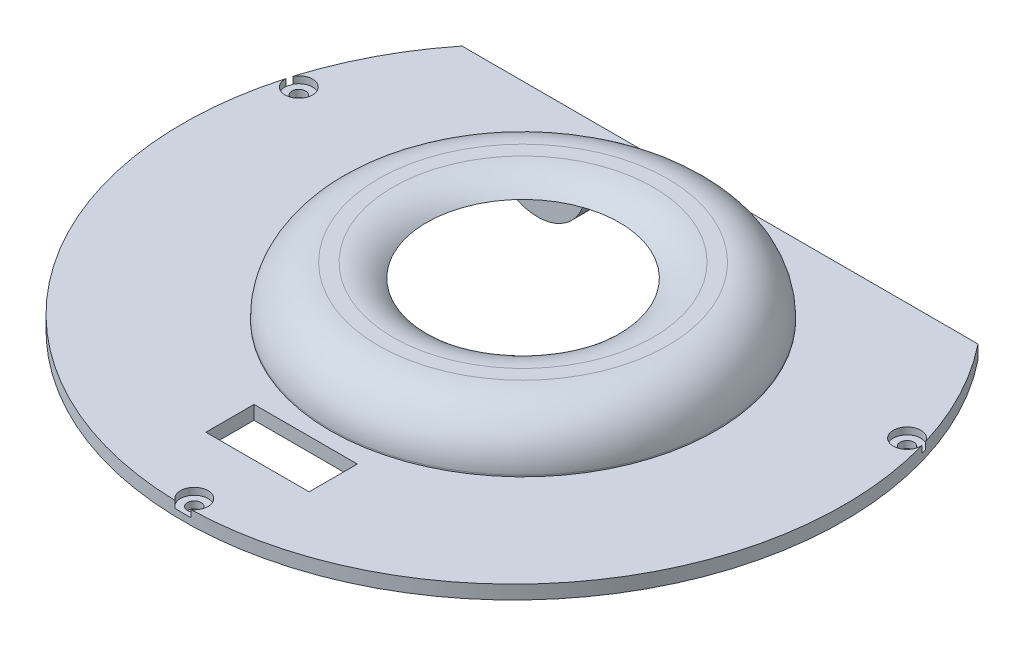
ISO-10303-21;
HEADER;
FILE_DESCRIPTION(('STEP AP214'),'2;1');
FILE_NAME('part.step','',(''),(''),'','','');
FILE_SCHEMA(('AUTOMOTIVE_DESIGN { 1 0 10303 214 1 1 1 1 }'));
ENDSEC;
DATA;
#1=APPLICATION_CONTEXT('core data for automotive mechanical design processes');
#2=APPLICATION_PROTOCOL_DEFINITION('international standard','automotive_design',2000,#1);
#3=PRODUCT_CONTEXT('',#1,'mechanical');
#4=PRODUCT('Part','Part','',(#3));
#5=PRODUCT_RELATED_PRODUCT_CATEGORY('part','',(#4));
#6=PRODUCT_DEFINITION_FORMATION('','',#4);
#7=PRODUCT_DEFINITION_CONTEXT('part definition',#1,'design');
#8=PRODUCT_DEFINITION('design','',#6,#7);
#9=PRODUCT_DEFINITION_SHAPE('','',#8);
#10=(LENGTH_UNIT() NAMED_UNIT(*) SI_UNIT(.MILLI.,.METRE.));
#11=(NAMED_UNIT(*) PLANE_ANGLE_UNIT() SI_UNIT($,.RADIAN.));
#12=(NAMED_UNIT(*) SI_UNIT($,.STERADIAN.) SOLID_ANGLE_UNIT());
#13=UNCERTAINTY_MEASURE_WITH_UNIT(LENGTH_MEASURE(1.E-05),#10,'distance_accuracy_value','');
#14=(GEOMETRIC_REPRESENTATION_CONTEXT(3) GLOBAL_UNCERTAINTY_ASSIGNED_CONTEXT((#13)) GLOBAL_UNIT_ASSIGNED_CONTEXT((#10,
#11,#12)) REPRESENTATION_CONTEXT('',''));
#15=CARTESIAN_POINT('',(0.,0.,0.));
#16=DIRECTION('',(0.,0.,1.));
#17=DIRECTION('',(1.,0.,0.));
#18=AXIS2_PLACEMENT_3D('',#15,#16,#17);
#19=CARTESIAN_POINT('',(0.,2.,0.));
#20=DIRECTION('',(0.,1.,0.));
#21=DIRECTION('',(0.,0.,1.));
#22=AXIS2_PLACEMENT_3D('',#19,#20,#21);
#23=PLANE('',#22);
#24=DIRECTION('',(0.,0.,1.));
#25=VECTOR('',#24,1.);
#26=CARTESIAN_POINT('',(-7.5,2.,30.1663519833163));
#27=LINE('',#26,#25);
#28=CARTESIAN_POINT('',(-7.5,2.,30.1663519833163));
#29=VERTEX_POINT('',#28);
#30=CARTESIAN_POINT('',(-7.5,2.,37.1663519833163));
#31=VERTEX_POINT('',#30);
#32=EDGE_CURVE('E51',#29,#31,#27,.T.);
#33=ORIENTED_EDGE('',*,*,#32,.F.);
#34=DIRECTION('',(-1.,0.,0.));
#35=VECTOR('',#34,1.);
#36=CARTESIAN_POINT('',(-7.5,2.,30.1663519833163));
#37=LINE('',#36,#35);
#38=CARTESIAN_POINT('',(7.5,2.,30.1663519833163));
#39=VERTEX_POINT('',#38);
#40=EDGE_CURVE('E203',#39,#29,#37,.T.);
#41=ORIENTED_EDGE('',*,*,#40,.F.);
#42=DIRECTION('',(0.,0.,-1.));
#43=VECTOR('',#42,1.);
#44=CARTESIAN_POINT('',(7.5,2.,30.1663519833163));
#45=LINE('',#44,#43);
#46=CARTESIAN_POINT('',(7.5,2.,37.1663519833163));
#47=VERTEX_POINT('',#46);
#48=EDGE_CURVE('E188',#47,#39,#45,.T.);
#49=ORIENTED_EDGE('',*,*,#48,.F.);
#50=DIRECTION('',(1.,0.,0.));
#51=VECTOR('',#50,1.);
#52=CARTESIAN_POINT('',(-7.5,2.,37.1663519833163));
#53=LINE('',#52,#51);
#54=EDGE_CURVE('E197',#31,#47,#53,.T.);
#55=ORIENTED_EDGE('',*,*,#54,.F.);
#56=EDGE_LOOP('',(#33,#41,#49,#55));
#57=FACE_BOUND('',#56,.T.);
#58=DIRECTION('',(-1.,0.,0.));
#59=VECTOR('',#58,1.);
#60=CARTESIAN_POINT('',(-37.4699879903904,2.,-30.));
#61=LINE('',#60,#59);
#62=CARTESIAN_POINT('',(37.4699879903904,2.,-30.));
#63=VERTEX_POINT('',#62);
#64=CARTESIAN_POINT('',(-37.4699879903904,2.,-30.));
#65=VERTEX_POINT('',#64);
#66=EDGE_CURVE('E307',#63,#65,#61,.T.);
#67=ORIENTED_EDGE('',*,*,#66,.T.);
#68=CARTESIAN_POINT('',(0.,2.,0.));
#69=DIRECTION('',(0.,1.,0.));
#70=DIRECTION('',(0.,0.,1.));
#71=AXIS2_PLACEMENT_3D('',#68,#69,#70);
#72=CIRCLE('',#71,48.);
#73=CARTESIAN_POINT('',(-45.9296824734979,2.,-13.9450445637027));
#74=VERTEX_POINT('',#73);
#75=EDGE_CURVE('E304',#65,#74,#72,.T.);
#76=ORIENTED_EDGE('',*,*,#75,.T.);
#77=CARTESIAN_POINT('',(-44.1670450256329,2.,-13.));
#78=DIRECTION('',(0.,1.,0.));
#79=DIRECTION('',(0.,0.,1.));
#80=AXIS2_PLACEMENT_3D('',#77,#78,#79);
#81=CIRCLE('',#80,2.);
#82=CARTESIAN_POINT('',(-46.1605913656759,2.,-13.1605396838842));
#83=VERTEX_POINT('',#82);
#84=EDGE_CURVE('E257',#83,#74,#81,.T.);
#85=ORIENTED_EDGE('',*,*,#84,.F.);
#86=CARTESIAN_POINT('',(-1.1468792364282,2.,47.9862966691226));
#87=VERTEX_POINT('',#86);
#88=EDGE_CURVE('E308',#83,#87,#72,.T.);
#89=ORIENTED_EDGE('',*,*,#88,.T.);
#90=CARTESIAN_POINT('',(0.,2.,46.3478010124149));
#91=DIRECTION('',(0.,1.,0.));
#92=DIRECTION('',(0.,0.,1.));
#93=AXIS2_PLACEMENT_3D('',#90,#91,#92);
#94=CIRCLE('',#93,2.);
#95=CARTESIAN_POINT('',(1.14687923642825,2.,47.9862966691226));
#96=VERTEX_POINT('',#95);
#97=EDGE_CURVE('E262',#96,#87,#94,.T.);
#98=ORIENTED_EDGE('',*,*,#97,.F.);
#99=CARTESIAN_POINT('',(46.1605913656758,2.,-13.1605396838842));
#100=VERTEX_POINT('',#99);
#101=EDGE_CURVE('E536',#96,#100,#72,.T.);
#102=ORIENTED_EDGE('',*,*,#101,.T.);
#103=CARTESIAN_POINT('',(44.1670450256329,2.,-13.));
#104=DIRECTION('',(0.,1.,0.));
#105=DIRECTION('',(0.,0.,1.));
#106=AXIS2_PLACEMENT_3D('',#103,#104,#105);
#107=CIRCLE('',#106,2.);
#108=CARTESIAN_POINT('',(45.929682473498,2.,-13.9450445637028));
#109=VERTEX_POINT('',#108);
#110=EDGE_CURVE('E252',#109,#100,#107,.T.);
#111=ORIENTED_EDGE('',*,*,#110,.F.);
#112=EDGE_CURVE('E309',#109,#63,#72,.T.);
#113=ORIENTED_EDGE('',*,*,#112,.T.);
#114=EDGE_LOOP('',(#67,#76,#85,#89,#98,#102,#111,#113));
#115=FACE_BOUND('',#114,.T.);
#116=CARTESIAN_POINT('',(1.35,2.,-0.0500000000000153));
#117=DIRECTION('',(0.,1.,0.));
#118=DIRECTION('',(0.,0.,1.));
#119=AXIS2_PLACEMENT_3D('',#116,#117,#118);
#120=CIRCLE('',#119,28.);
#121=CARTESIAN_POINT('',(1.35,2.,27.95));
#122=VERTEX_POINT('',#121);
#123=EDGE_CURVE('E249',#122,#122,#120,.T.);
#124=ORIENTED_EDGE('',*,*,#123,.F.);
#125=EDGE_LOOP('',(#124));
#126=FACE_BOUND('',#125,.T.);
#127=ADVANCED_FACE('F36',(#57,#115,#126),#23,.T.);
#128=CARTESIAN_POINT('',(44.1670450256329,0.,-13.));
#129=DIRECTION('',(0.,1.,0.));
#130=DIRECTION('',(0.,0.,1.));
#131=AXIS2_PLACEMENT_3D('',#128,#129,#130);
#132=CYLINDRICAL_SURFACE('',#131,0.999999999999998);
#133=CARTESIAN_POINT('',(44.1670450256329,0.,-13.));
#134=DIRECTION('',(0.,1.,0.));
#135=DIRECTION('',(0.,0.,1.));
#136=AXIS2_PLACEMENT_3D('',#133,#134,#135);
#137=CIRCLE('',#136,0.999999999999998);
#138=CARTESIAN_POINT('',(44.1670450256329,0.,-12.));
#139=VERTEX_POINT('',#138);
#140=EDGE_CURVE('E294',#139,#139,#137,.T.);
#141=ORIENTED_EDGE('',*,*,#140,.F.);
#142=EDGE_LOOP('',(#141));
#143=FACE_BOUND('',#142,.T.);
#144=CARTESIAN_POINT('',(44.1670450256329,1.,-13.));
#145=DIRECTION('',(0.,1.,0.));
#146=DIRECTION('',(0.,0.,1.));
#147=AXIS2_PLACEMENT_3D('',#144,#145,#146);
#148=CIRCLE('',#147,0.999999999999998);
#149=CARTESIAN_POINT('',(44.1670450256329,1.,-12.));
#150=VERTEX_POINT('',#149);
#151=EDGE_CURVE('E273',#150,#150,#148,.F.);
#152=ORIENTED_EDGE('',*,*,#151,.F.);
#153=EDGE_LOOP('',(#152));
#154=FACE_BOUND('',#153,.T.);
#155=ADVANCED_FACE('F418',(#143,#154),#132,.F.);
#156=CARTESIAN_POINT('',(0.,0.,46.3478010124149));
#157=DIRECTION('',(0.,1.,0.));
#158=DIRECTION('',(0.,0.,1.));
#159=AXIS2_PLACEMENT_3D('',#156,#157,#158);
#160=CYLINDRICAL_SURFACE('',#159,1.);
#161=CARTESIAN_POINT('',(0.,0.,46.3478010124149));
#162=DIRECTION('',(0.,1.,0.));
#163=DIRECTION('',(0.,0.,1.));
#164=AXIS2_PLACEMENT_3D('',#161,#162,#163);
#165=CIRCLE('',#164,1.);
#166=CARTESIAN_POINT('',(0.,0.,47.3478010124149));
#167=VERTEX_POINT('',#166);
#168=EDGE_CURVE('E299',#167,#167,#165,.T.);
#169=ORIENTED_EDGE('',*,*,#168,.F.);
#170=EDGE_LOOP('',(#169));
#171=FACE_BOUND('',#170,.T.);
#172=CARTESIAN_POINT('',(0.,1.,46.3478010124149));
#173=DIRECTION('',(0.,1.,0.));
#174=DIRECTION('',(0.,0.,1.));
#175=AXIS2_PLACEMENT_3D('',#172,#173,#174);
#176=CIRCLE('',#175,1.);
#177=CARTESIAN_POINT('',(0.,1.,47.3478010124149));
#178=VERTEX_POINT('',#177);
#179=EDGE_CURVE('E270',#178,#178,#176,.F.);
#180=ORIENTED_EDGE('',*,*,#179,.F.);
#181=EDGE_LOOP('',(#180));
#182=FACE_BOUND('',#181,.T.);
#183=ADVANCED_FACE('F423',(#171,#182),#160,.F.);
#184=CARTESIAN_POINT('',(-44.1670450256329,0.,-13.));
#185=DIRECTION('',(0.,1.,0.));
#186=DIRECTION('',(0.,0.,1.));
#187=AXIS2_PLACEMENT_3D('',#184,#185,#186);
#188=CYLINDRICAL_SURFACE('',#187,0.999999999999998);
#189=CARTESIAN_POINT('',(-44.1670450256329,0.,-13.));
#190=DIRECTION('',(0.,1.,0.));
#191=DIRECTION('',(0.,0.,1.));
#192=AXIS2_PLACEMENT_3D('',#189,#190,#191);
#193=CIRCLE('',#192,0.999999999999998);
#194=CARTESIAN_POINT('',(-44.1670450256329,0.,-12.));
#195=VERTEX_POINT('',#194);
#196=EDGE_CURVE('E295',#195,#195,#193,.T.);
#197=ORIENTED_EDGE('',*,*,#196,.F.);
#198=EDGE_LOOP('',(#197));
#199=FACE_BOUND('',#198,.T.);
#200=CARTESIAN_POINT('',(-44.1670450256329,1.,-13.));
#201=DIRECTION('',(0.,1.,0.));
#202=DIRECTION('',(0.,0.,1.));
#203=AXIS2_PLACEMENT_3D('',#200,#201,#202);
#204=CIRCLE('',#203,0.999999999999998);
#205=CARTESIAN_POINT('',(-44.1670450256329,1.,-12.));
#206=VERTEX_POINT('',#205);
#207=EDGE_CURVE('E256',#206,#206,#204,.F.);
#208=ORIENTED_EDGE('',*,*,#207,.F.);
#209=EDGE_LOOP('',(#208));
#210=FACE_BOUND('',#209,.T.);
#211=ADVANCED_FACE('F438',(#199,#210),#188,.F.);
#212=CARTESIAN_POINT('',(0.,2.,0.));
#213=DIRECTION('',(0.,-1.,0.));
#214=DIRECTION('',(0.,0.,-1.));
#215=AXIS2_PLACEMENT_3D('',#212,#213,#214);
#216=CYLINDRICAL_SURFACE('',#215,48.);
#217=CARTESIAN_POINT('',(0.,1.,0.));
#218=DIRECTION('',(0.,1.,0.));
#219=DIRECTION('',(0.,0.,1.));
#220=AXIS2_PLACEMENT_3D('',#217,#218,#219);
#221=CIRCLE('',#220,48.);
#222=CARTESIAN_POINT('',(-45.9296824734981,1.,-13.9450445637023));
#223=VERTEX_POINT('',#222);
#224=CARTESIAN_POINT('',(-46.1605913656757,1.,-13.1605396838847));
#225=VERTEX_POINT('',#224);
#226=EDGE_CURVE('E268',#223,#225,#221,.T.);
#227=ORIENTED_EDGE('',*,*,#226,.F.);
#228=DIRECTION('',(0.,1.,0.));
#229=VECTOR('',#228,1.);
#230=CARTESIAN_POINT('',(-45.9296824734979,1.5,-13.9450445637027));
#231=LINE('',#230,#229);
#232=EDGE_CURVE('E291',#223,#74,#231,.T.);
#233=ORIENTED_EDGE('',*,*,#232,.T.);
#234=ORIENTED_EDGE('',*,*,#75,.F.);
#235=DIRECTION('',(0.,-1.,0.));
#236=VECTOR('',#235,1.);
#237=CARTESIAN_POINT('',(-37.4699879903904,2.,-30.));
#238=LINE('',#237,#236);
#239=CARTESIAN_POINT('',(-37.4699879903904,0.,-30.));
#240=VERTEX_POINT('',#239);
#241=EDGE_CURVE('E311',#65,#240,#238,.T.);
#242=ORIENTED_EDGE('',*,*,#241,.T.);
#243=CARTESIAN_POINT('',(0.,0.,0.));
#244=DIRECTION('',(0.,1.,0.));
#245=DIRECTION('',(0.,0.,1.));
#246=AXIS2_PLACEMENT_3D('',#243,#244,#245);
#247=CIRCLE('',#246,48.);
#248=CARTESIAN_POINT('',(37.4699879903904,0.,-30.));
#249=VERTEX_POINT('',#248);
#250=EDGE_CURVE('E298',#240,#249,#247,.T.);
#251=ORIENTED_EDGE('',*,*,#250,.T.);
#252=DIRECTION('',(0.,-1.,0.));
#253=VECTOR('',#252,1.);
#254=CARTESIAN_POINT('',(37.4699879903904,2.,-30.));
#255=LINE('',#254,#253);
#256=EDGE_CURVE('E321',#63,#249,#255,.T.);
#257=ORIENTED_EDGE('',*,*,#256,.F.);
#258=ORIENTED_EDGE('',*,*,#112,.F.);
#259=DIRECTION('',(0.,1.,0.));
#260=VECTOR('',#259,1.);
#261=CARTESIAN_POINT('',(45.9296824734979,1.5,-13.9450445637027));
#262=LINE('',#261,#260);
#263=CARTESIAN_POINT('',(45.9296824734981,1.,-13.9450445637023));
#264=VERTEX_POINT('',#263);
#265=EDGE_CURVE('E276',#109,#264,#262,.F.);
#266=ORIENTED_EDGE('',*,*,#265,.T.);
#267=CARTESIAN_POINT('',(0.,1.,0.));
#268=DIRECTION('',(0.,1.,0.));
#269=DIRECTION('',(0.,0.,1.));
#270=AXIS2_PLACEMENT_3D('',#267,#268,#269);
#271=CIRCLE('',#270,48.);
#272=CARTESIAN_POINT('',(46.1605913656757,1.,-13.1605396838847));
#273=VERTEX_POINT('',#272);
#274=EDGE_CURVE('E274',#273,#264,#271,.T.);
#275=ORIENTED_EDGE('',*,*,#274,.F.);
#276=DIRECTION('',(0.,1.,0.));
#277=VECTOR('',#276,1.);
#278=CARTESIAN_POINT('',(46.1605913656758,1.5,-13.1605396838842));
#279=LINE('',#278,#277);
#280=EDGE_CURVE('E279',#273,#100,#279,.T.);
#281=ORIENTED_EDGE('',*,*,#280,.T.);
#282=ORIENTED_EDGE('',*,*,#101,.F.);
#283=DIRECTION('',(0.,1.,0.));
#284=VECTOR('',#283,1.);
#285=CARTESIAN_POINT('',(1.1468792364282,1.5,47.9862966691226));
#286=LINE('',#285,#284);
#287=CARTESIAN_POINT('',(1.14687923642809,1.,47.9862966691226));
#288=VERTEX_POINT('',#287);
#289=EDGE_CURVE('E282',#96,#288,#286,.F.);
#290=ORIENTED_EDGE('',*,*,#289,.T.);
#291=CARTESIAN_POINT('',(0.,1.,0.));
#292=DIRECTION('',(0.,1.,0.));
#293=DIRECTION('',(0.,0.,1.));
#294=AXIS2_PLACEMENT_3D('',#291,#292,#293);
#295=CIRCLE('',#294,48.);
#296=CARTESIAN_POINT('',(-1.14687923642809,1.,47.9862966691226));
#297=VERTEX_POINT('',#296);
#298=EDGE_CURVE('E271',#297,#288,#295,.T.);
#299=ORIENTED_EDGE('',*,*,#298,.F.);
#300=DIRECTION('',(0.,1.,0.));
#301=VECTOR('',#300,1.);
#302=CARTESIAN_POINT('',(-1.1468792364282,1.5,47.9862966691226));
#303=LINE('',#302,#301);
#304=EDGE_CURVE('E285',#297,#87,#303,.T.);
#305=ORIENTED_EDGE('',*,*,#304,.T.);
#306=ORIENTED_EDGE('',*,*,#88,.F.);
#307=DIRECTION('',(0.,1.,0.));
#308=VECTOR('',#307,1.);
#309=CARTESIAN_POINT('',(-46.1605913656758,1.5,-13.1605396838842));
#310=LINE('',#309,#308);
#311=EDGE_CURVE('E288',#83,#225,#310,.F.);
#312=ORIENTED_EDGE('',*,*,#311,.T.);
#313=EDGE_LOOP('',(#227,#233,#234,#242,#251,#257,#258,#266,#275,#281,#282,#290,#299,#305,#306,#312));
#314=FACE_BOUND('',#313,.T.);
#315=ADVANCED_FACE('F434',(#314),#216,.T.);
#316=CARTESIAN_POINT('',(-37.4699879903904,2.,-30.));
#317=DIRECTION('',(0.,0.,1.));
#318=DIRECTION('',(1.,0.,0.));
#319=AXIS2_PLACEMENT_3D('',#316,#317,#318);
#320=PLANE('',#319);
#321=CARTESIAN_POINT('',(22.4699879903904,-3.,-30.));
#322=DIRECTION('',(0.,0.,-1.));
#323=DIRECTION('',(-1.,0.,0.));
#324=AXIS2_PLACEMENT_3D('',#321,#322,#323);
#325=CIRCLE('',#324,3.25);
#326=CARTESIAN_POINT('',(19.2199879903904,-3.,-30.));
#327=VERTEX_POINT('',#326);
#328=EDGE_CURVE('E217',#327,#327,#325,.T.);
#329=ORIENTED_EDGE('',*,*,#328,.F.);
#330=EDGE_LOOP('',(#329));
#331=FACE_BOUND('',#330,.T.);
#332=CARTESIAN_POINT('',(-22.4699879903904,-3.,-30.));
#333=DIRECTION('',(0.,0.,-1.));
#334=DIRECTION('',(-1.,0.,0.));
#335=AXIS2_PLACEMENT_3D('',#332,#333,#334);
#336=CIRCLE('',#335,3.25);
#337=CARTESIAN_POINT('',(-25.7199879903904,-3.,-30.));
#338=VERTEX_POINT('',#337);
#339=EDGE_CURVE('E210',#338,#338,#336,.T.);
#340=ORIENTED_EDGE('',*,*,#339,.F.);
#341=EDGE_LOOP('',(#340));
#342=FACE_BOUND('',#341,.T.);
#343=CARTESIAN_POINT('',(-22.4699879903904,-3.,-30.));
#344=DIRECTION('',(0.,0.,1.));
#345=DIRECTION('',(1.,0.,0.));
#346=AXIS2_PLACEMENT_3D('',#343,#344,#345);
#347=CIRCLE('',#346,7.);
#348=CARTESIAN_POINT('',(-15.4699879903904,-3.,-30.));
#349=VERTEX_POINT('',#348);
#350=CARTESIAN_POINT('',(-22.4699879903904,-10.,-30.));
#351=VERTEX_POINT('',#350);
#352=EDGE_CURVE('E352',#349,#351,#347,.F.);
#353=ORIENTED_EDGE('',*,*,#352,.T.);
#354=CARTESIAN_POINT('',(-22.4699879903904,-3.,-30.));
#355=DIRECTION('',(0.,0.,1.));
#356=DIRECTION('',(1.,0.,0.));
#357=AXIS2_PLACEMENT_3D('',#354,#355,#356);
#358=CIRCLE('',#357,7.);
#359=CARTESIAN_POINT('',(-29.4699879903904,-3.,-30.));
#360=VERTEX_POINT('',#359);
#361=EDGE_CURVE('E354',#351,#360,#358,.F.);
#362=ORIENTED_EDGE('',*,*,#361,.T.);
#363=DIRECTION('',(0.,1.,0.));
#364=VECTOR('',#363,1.);
#365=CARTESIAN_POINT('',(-29.4699879903904,2.,-30.));
#366=LINE('',#365,#364);
#367=CARTESIAN_POINT('',(-29.4699879903904,0.,-30.));
#368=VERTEX_POINT('',#367);
#369=EDGE_CURVE('E229',#360,#368,#366,.T.);
#370=ORIENTED_EDGE('',*,*,#369,.T.);
#371=DIRECTION('',(-1.,0.,0.));
#372=VECTOR('',#371,1.);
#373=CARTESIAN_POINT('',(-37.4699879903904,0.,-30.));
#374=LINE('',#373,#372);
#375=EDGE_CURVE('E314',#368,#240,#374,.T.);
#376=ORIENTED_EDGE('',*,*,#375,.T.);
#377=ORIENTED_EDGE('',*,*,#241,.F.);
#378=ORIENTED_EDGE('',*,*,#66,.F.);
#379=ORIENTED_EDGE('',*,*,#256,.T.);
#380=CARTESIAN_POINT('',(29.4699879903904,0.,-30.));
#381=VERTEX_POINT('',#380);
#382=EDGE_CURVE('E315',#249,#381,#374,.T.);
#383=ORIENTED_EDGE('',*,*,#382,.T.);
#384=DIRECTION('',(0.,-1.,0.));
#385=VECTOR('',#384,1.);
#386=CARTESIAN_POINT('',(29.4699879903904,2.,-30.));
#387=LINE('',#386,#385);
#388=CARTESIAN_POINT('',(29.4699879903904,-3.,-30.));
#389=VERTEX_POINT('',#388);
#390=EDGE_CURVE('E231',#381,#389,#387,.T.);
#391=ORIENTED_EDGE('',*,*,#390,.T.);
#392=CARTESIAN_POINT('',(22.4699879903904,-3.,-30.));
#393=DIRECTION('',(0.,0.,1.));
#394=DIRECTION('',(1.,0.,0.));
#395=AXIS2_PLACEMENT_3D('',#392,#393,#394);
#396=CIRCLE('',#395,7.);
#397=CARTESIAN_POINT('',(22.4699879903904,-10.,-30.));
#398=VERTEX_POINT('',#397);
#399=EDGE_CURVE('E348',#389,#398,#396,.F.);
#400=ORIENTED_EDGE('',*,*,#399,.T.);
#401=CARTESIAN_POINT('',(22.4699879903904,-3.,-30.));
#402=DIRECTION('',(0.,0.,1.));
#403=DIRECTION('',(1.,0.,0.));
#404=AXIS2_PLACEMENT_3D('',#401,#402,#403);
#405=CIRCLE('',#404,7.);
#406=CARTESIAN_POINT('',(15.4699879903904,-3.,-30.));
#407=VERTEX_POINT('',#406);
#408=EDGE_CURVE('E350',#398,#407,#405,.F.);
#409=ORIENTED_EDGE('',*,*,#408,.T.);
#410=DIRECTION('',(0.,1.,0.));
#411=VECTOR('',#410,1.);
#412=CARTESIAN_POINT('',(15.4699879903904,2.,-30.));
#413=LINE('',#412,#411);
#414=CARTESIAN_POINT('',(15.4699879903904,0.,-30.));
#415=VERTEX_POINT('',#414);
#416=EDGE_CURVE('E241',#407,#415,#413,.T.);
#417=ORIENTED_EDGE('',*,*,#416,.T.);
#418=CARTESIAN_POINT('',(-15.4699879903904,0.,-30.));
#419=VERTEX_POINT('',#418);
#420=EDGE_CURVE('E318',#415,#419,#374,.T.);
#421=ORIENTED_EDGE('',*,*,#420,.T.);
#422=DIRECTION('',(0.,-1.,0.));
#423=VECTOR('',#422,1.);
#424=CARTESIAN_POINT('',(-15.4699879903904,2.,-30.));
#425=LINE('',#424,#423);
#426=EDGE_CURVE('E232',#419,#349,#425,.T.);
#427=ORIENTED_EDGE('',*,*,#426,.T.);
#428=EDGE_LOOP('',(#353,#362,#370,#376,#377,#378,#379,#383,#391,#400,#409,#417,#421,#427));
#429=FACE_BOUND('',#428,.T.);
#430=ADVANCED_FACE('F431',(#331,#342,#429),#320,.F.);
#431=CARTESIAN_POINT('',(0.,0.,0.));
#432=DIRECTION('',(0.,1.,0.));
#433=DIRECTION('',(0.,0.,1.));
#434=AXIS2_PLACEMENT_3D('',#431,#432,#433);
#435=PLANE('',#434);
#436=DIRECTION('',(-1.,0.,0.));
#437=VECTOR('',#436,1.);
#438=CARTESIAN_POINT('',(0.,0.,30.1663519833163));
#439=LINE('',#438,#437);
#440=CARTESIAN_POINT('',(7.5,0.,30.1663519833163));
#441=VERTEX_POINT('',#440);
#442=CARTESIAN_POINT('',(-7.5,0.,30.1663519833163));
#443=VERTEX_POINT('',#442);
#444=EDGE_CURVE('E44',#441,#443,#439,.T.);
#445=ORIENTED_EDGE('',*,*,#444,.T.);
#446=DIRECTION('',(0.,0.,1.));
#447=VECTOR('',#446,1.);
#448=CARTESIAN_POINT('',(-7.50000000000001,0.,0.));
#449=LINE('',#448,#447);
#450=CARTESIAN_POINT('',(-7.5,0.,37.1663519833163));
#451=VERTEX_POINT('',#450);
#452=EDGE_CURVE('E11',#443,#451,#449,.T.);
#453=ORIENTED_EDGE('',*,*,#452,.T.);
#454=DIRECTION('',(1.,0.,0.));
#455=VECTOR('',#454,1.);
#456=CARTESIAN_POINT('',(0.,0.,37.1663519833163));
#457=LINE('',#456,#455);
#458=CARTESIAN_POINT('',(7.5,0.,37.1663519833163));
#459=VERTEX_POINT('',#458);
#460=EDGE_CURVE('E396',#451,#459,#457,.T.);
#461=ORIENTED_EDGE('',*,*,#460,.T.);
#462=DIRECTION('',(0.,0.,-1.));
#463=VECTOR('',#462,1.);
#464=CARTESIAN_POINT('',(7.50000000000001,0.,0.));
#465=LINE('',#464,#463);
#466=EDGE_CURVE('E191',#459,#441,#465,.T.);
#467=ORIENTED_EDGE('',*,*,#466,.T.);
#468=EDGE_LOOP('',(#445,#453,#461,#467));
#469=FACE_BOUND('',#468,.T.);
#470=CARTESIAN_POINT('',(1.35,0.,-0.0500000000000153));
#471=DIRECTION('',(0.,1.,0.));
#472=DIRECTION('',(0.,0.,1.));
#473=AXIS2_PLACEMENT_3D('',#470,#471,#472);
#474=CIRCLE('',#473,27.959899496853);
#475=CARTESIAN_POINT('',(1.35,0.,27.909899496853));
#476=VERTEX_POINT('',#475);
#477=EDGE_CURVE('E390',#476,#476,#474,.T.);
#478=ORIENTED_EDGE('',*,*,#477,.T.);
#479=EDGE_LOOP('',(#478));
#480=FACE_BOUND('',#479,.T.);
#481=ORIENTED_EDGE('',*,*,#196,.T.);
#482=EDGE_LOOP('',(#481));
#483=FACE_BOUND('',#482,.T.);
#484=ORIENTED_EDGE('',*,*,#168,.T.);
#485=EDGE_LOOP('',(#484));
#486=FACE_BOUND('',#485,.T.);
#487=ORIENTED_EDGE('',*,*,#140,.T.);
#488=EDGE_LOOP('',(#487));
#489=FACE_BOUND('',#488,.T.);
#490=DIRECTION('',(-1.,0.,0.));
#491=VECTOR('',#490,1.);
#492=CARTESIAN_POINT('',(0.,0.,-26.));
#493=LINE('',#492,#491);
#494=CARTESIAN_POINT('',(-15.4699879903904,0.,-26.));
#495=VERTEX_POINT('',#494);
#496=CARTESIAN_POINT('',(-29.4699879903904,0.,-26.));
#497=VERTEX_POINT('',#496);
#498=EDGE_CURVE('E339',#495,#497,#493,.T.);
#499=ORIENTED_EDGE('',*,*,#498,.F.);
#500=DIRECTION('',(0.,0.,-1.));
#501=VECTOR('',#500,1.);
#502=CARTESIAN_POINT('',(-15.4699879903904,0.,0.));
#503=LINE('',#502,#501);
#504=EDGE_CURVE('E345',#495,#419,#503,.T.);
#505=ORIENTED_EDGE('',*,*,#504,.T.);
#506=ORIENTED_EDGE('',*,*,#420,.F.);
#507=DIRECTION('',(0.,0.,1.));
#508=VECTOR('',#507,1.);
#509=CARTESIAN_POINT('',(15.4699879903904,0.,0.));
#510=LINE('',#509,#508);
#511=CARTESIAN_POINT('',(15.4699879903904,0.,-26.));
#512=VERTEX_POINT('',#511);
#513=EDGE_CURVE('E333',#415,#512,#510,.T.);
#514=ORIENTED_EDGE('',*,*,#513,.T.);
#515=DIRECTION('',(-1.,0.,0.));
#516=VECTOR('',#515,1.);
#517=CARTESIAN_POINT('',(0.,0.,-26.));
#518=LINE('',#517,#516);
#519=CARTESIAN_POINT('',(29.4699879903904,0.,-26.));
#520=VERTEX_POINT('',#519);
#521=EDGE_CURVE('E324',#520,#512,#518,.T.);
#522=ORIENTED_EDGE('',*,*,#521,.F.);
#523=DIRECTION('',(0.,0.,-1.));
#524=VECTOR('',#523,1.);
#525=CARTESIAN_POINT('',(29.4699879903904,0.,0.));
#526=LINE('',#525,#524);
#527=EDGE_CURVE('E336',#520,#381,#526,.T.);
#528=ORIENTED_EDGE('',*,*,#527,.T.);
#529=ORIENTED_EDGE('',*,*,#382,.F.);
#530=ORIENTED_EDGE('',*,*,#250,.F.);
#531=ORIENTED_EDGE('',*,*,#375,.F.);
#532=DIRECTION('',(0.,0.,1.));
#533=VECTOR('',#532,1.);
#534=CARTESIAN_POINT('',(-29.4699879903904,0.,0.));
#535=LINE('',#534,#533);
#536=EDGE_CURVE('E342',#368,#497,#535,.T.);
#537=ORIENTED_EDGE('',*,*,#536,.T.);
#538=EDGE_LOOP('',(#499,#505,#506,#514,#522,#528,#529,#530,#531,#537));
#539=FACE_BOUND('',#538,.T.);
#540=ADVANCED_FACE('F400',(#469,#480,#483,#486,#489,#539),#435,.F.);
#541=CARTESIAN_POINT('',(-44.1670450256329,1.,-13.));
#542=DIRECTION('',(0.,1.,0.));
#543=DIRECTION('',(0.,0.,1.));
#544=AXIS2_PLACEMENT_3D('',#541,#542,#543);
#545=CYLINDRICAL_SURFACE('',#544,2.);
#546=CARTESIAN_POINT('',(-44.1670450256329,1.,-13.));
#547=DIRECTION('',(0.,1.,0.));
#548=DIRECTION('',(0.,0.,1.));
#549=AXIS2_PLACEMENT_3D('',#546,#547,#548);
#550=CIRCLE('',#549,2.);
#551=EDGE_CURVE('E253',#225,#223,#550,.T.);
#552=ORIENTED_EDGE('',*,*,#551,.F.);
#553=ORIENTED_EDGE('',*,*,#311,.F.);
#554=ORIENTED_EDGE('',*,*,#84,.T.);
#555=ORIENTED_EDGE('',*,*,#232,.F.);
#556=EDGE_LOOP('',(#552,#553,#554,#555));
#557=FACE_BOUND('',#556,.T.);
#558=ADVANCED_FACE('F430',(#557),#545,.F.);
#559=CARTESIAN_POINT('',(-44.1670450256329,1.,-13.));
#560=DIRECTION('',(0.,1.,0.));
#561=DIRECTION('',(0.,0.,1.));
#562=AXIS2_PLACEMENT_3D('',#559,#560,#561);
#563=PLANE('',#562);
#564=ORIENTED_EDGE('',*,*,#207,.T.);
#565=EDGE_LOOP('',(#564));
#566=FACE_BOUND('',#565,.T.);
#567=ORIENTED_EDGE('',*,*,#226,.T.);
#568=ORIENTED_EDGE('',*,*,#551,.T.);
#569=EDGE_LOOP('',(#567,#568));
#570=FACE_BOUND('',#569,.T.);
#571=ADVANCED_FACE('F498',(#566,#570),#563,.T.);
#572=CARTESIAN_POINT('',(0.,1.,46.3478010124149));
#573=DIRECTION('',(0.,1.,0.));
#574=DIRECTION('',(0.,0.,1.));
#575=AXIS2_PLACEMENT_3D('',#572,#573,#574);
#576=CYLINDRICAL_SURFACE('',#575,2.);
#577=CARTESIAN_POINT('',(0.,1.,46.3478010124149));
#578=DIRECTION('',(0.,1.,0.));
#579=DIRECTION('',(0.,0.,1.));
#580=AXIS2_PLACEMENT_3D('',#577,#578,#579);
#581=CIRCLE('',#580,2.);
#582=EDGE_CURVE('E259',#288,#297,#581,.T.);
#583=ORIENTED_EDGE('',*,*,#582,.F.);
#584=ORIENTED_EDGE('',*,*,#289,.F.);
#585=ORIENTED_EDGE('',*,*,#97,.T.);
#586=ORIENTED_EDGE('',*,*,#304,.F.);
#587=EDGE_LOOP('',(#583,#584,#585,#586));
#588=FACE_BOUND('',#587,.T.);
#589=ADVANCED_FACE('F501',(#588),#576,.F.);
#590=CARTESIAN_POINT('',(0.,1.,46.3478010124149));
#591=DIRECTION('',(0.,1.,0.));
#592=DIRECTION('',(0.,0.,1.));
#593=AXIS2_PLACEMENT_3D('',#590,#591,#592);
#594=PLANE('',#593);
#595=ORIENTED_EDGE('',*,*,#179,.T.);
#596=EDGE_LOOP('',(#595));
#597=FACE_BOUND('',#596,.T.);
#598=ORIENTED_EDGE('',*,*,#298,.T.);
#599=ORIENTED_EDGE('',*,*,#582,.T.);
#600=EDGE_LOOP('',(#598,#599));
#601=FACE_BOUND('',#600,.T.);
#602=ADVANCED_FACE('F506',(#597,#601),#594,.T.);
#603=CARTESIAN_POINT('',(44.1670450256329,1.,-13.));
#604=DIRECTION('',(0.,1.,0.));
#605=DIRECTION('',(0.,0.,1.));
#606=AXIS2_PLACEMENT_3D('',#603,#604,#605);
#607=CYLINDRICAL_SURFACE('',#606,2.);
#608=CARTESIAN_POINT('',(44.1670450256329,1.,-13.));
#609=DIRECTION('',(0.,1.,0.));
#610=DIRECTION('',(0.,0.,1.));
#611=AXIS2_PLACEMENT_3D('',#608,#609,#610);
#612=CIRCLE('',#611,2.);
#613=EDGE_CURVE('E264',#264,#273,#612,.T.);
#614=ORIENTED_EDGE('',*,*,#613,.F.);
#615=ORIENTED_EDGE('',*,*,#265,.F.);
#616=ORIENTED_EDGE('',*,*,#110,.T.);
#617=ORIENTED_EDGE('',*,*,#280,.F.);
#618=EDGE_LOOP('',(#614,#615,#616,#617));
#619=FACE_BOUND('',#618,.T.);
#620=ADVANCED_FACE('F509',(#619),#607,.F.);
#621=CARTESIAN_POINT('',(44.1670450256329,1.,-13.));
#622=DIRECTION('',(0.,1.,0.));
#623=DIRECTION('',(0.,0.,1.));
#624=AXIS2_PLACEMENT_3D('',#621,#622,#623);
#625=PLANE('',#624);
#626=ORIENTED_EDGE('',*,*,#151,.T.);
#627=EDGE_LOOP('',(#626));
#628=FACE_BOUND('',#627,.T.);
#629=ORIENTED_EDGE('',*,*,#274,.T.);
#630=ORIENTED_EDGE('',*,*,#613,.T.);
#631=EDGE_LOOP('',(#629,#630));
#632=FACE_BOUND('',#631,.T.);
#633=ADVANCED_FACE('F495',(#628,#632),#625,.T.);
#634=CARTESIAN_POINT('',(1.35,9.2,-0.0500000000000153));
#635=DIRECTION('',(0.,1.,0.));
#636=DIRECTION('',(0.,0.,1.));
#637=AXIS2_PLACEMENT_3D('',#634,#635,#636);
#638=PLANE('',#637);
#639=CARTESIAN_POINT('',(1.35,9.2,-0.0500000000000153));
#640=DIRECTION('',(0.,1.,0.));
#641=DIRECTION('',(0.,0.,1.));
#642=AXIS2_PLACEMENT_3D('',#639,#640,#641);
#643=CIRCLE('',#642,18.8989794855664);
#644=CARTESIAN_POINT('',(1.35,9.2,18.8489794855663));
#645=VERTEX_POINT('',#644);
#646=EDGE_CURVE('E384',#645,#645,#643,.F.);
#647=ORIENTED_EDGE('',*,*,#646,.T.);
#648=EDGE_LOOP('',(#647));
#649=FACE_BOUND('',#648,.T.);
#650=CARTESIAN_POINT('',(1.35,9.2,-0.0500000000000153));
#651=DIRECTION('',(0.,1.,0.));
#652=DIRECTION('',(0.,0.,1.));
#653=AXIS2_PLACEMENT_3D('',#650,#651,#652);
#654=CIRCLE('',#653,21.);
#655=CARTESIAN_POINT('',(1.35,9.2,20.95));
#656=VERTEX_POINT('',#655);
#657=EDGE_CURVE('E374',#656,#656,#654,.T.);
#658=ORIENTED_EDGE('',*,*,#657,.T.);
#659=EDGE_LOOP('',(#658));
#660=FACE_BOUND('',#659,.T.);
#661=ADVANCED_FACE('F489',(#649,#660),#638,.T.);
#662=CARTESIAN_POINT('',(1.35,9.2,-0.0500000000000153));
#663=DIRECTION('',(0.,-1.,0.));
#664=DIRECTION('',(0.,0.,-1.));
#665=AXIS2_PLACEMENT_3D('',#662,#663,#664);
#666=CYLINDRICAL_SURFACE('',#665,28.);
#667=CARTESIAN_POINT('',(1.35,2.2,-0.0500000000000153));
#668=DIRECTION('',(0.,1.,0.));
#669=DIRECTION('',(0.,0.,1.));
#670=AXIS2_PLACEMENT_3D('',#667,#668,#669);
#671=CIRCLE('',#670,28.);
#672=CARTESIAN_POINT('',(1.35,2.2,27.95));
#673=VERTEX_POINT('',#672);
#674=EDGE_CURVE('E381',#673,#673,#671,.F.);
#675=ORIENTED_EDGE('',*,*,#674,.T.);
#676=EDGE_LOOP('',(#675));
#677=FACE_BOUND('',#676,.T.);
#678=ORIENTED_EDGE('',*,*,#123,.T.);
#679=EDGE_LOOP('',(#678));
#680=FACE_BOUND('',#679,.T.);
#681=ADVANCED_FACE('F478',(#677,#680),#666,.T.);
#682=CARTESIAN_POINT('',(1.35,7.2,-0.0500000000000153));
#683=DIRECTION('',(0.,1.,0.));
#684=DIRECTION('',(0.,0.,1.));
#685=AXIS2_PLACEMENT_3D('',#682,#683,#684);
#686=PLANE('',#685);
#687=CARTESIAN_POINT('',(1.35,7.2,-0.0500000000000153));
#688=DIRECTION('',(0.,1.,0.));
#689=DIRECTION('',(0.,0.,1.));
#690=AXIS2_PLACEMENT_3D('',#687,#688,#689);
#691=CIRCLE('',#690,20.);
#692=CARTESIAN_POINT('',(1.35,7.2,19.95));
#693=VERTEX_POINT('',#692);
#694=EDGE_CURVE('E387',#693,#693,#691,.F.);
#695=ORIENTED_EDGE('',*,*,#694,.T.);
#696=EDGE_LOOP('',(#695));
#697=FACE_BOUND('',#696,.T.);
#698=CARTESIAN_POINT('',(1.35,7.2,-0.0500000000000153));
#699=DIRECTION('',(0.,1.,0.));
#700=DIRECTION('',(0.,0.,1.));
#701=AXIS2_PLACEMENT_3D('',#698,#699,#700);
#702=CIRCLE('',#701,14.);
#703=CARTESIAN_POINT('',(1.35,7.2,13.95));
#704=VERTEX_POINT('',#703);
#705=EDGE_CURVE('E243',#704,#704,#702,.T.);
#706=ORIENTED_EDGE('',*,*,#705,.T.);
#707=EDGE_LOOP('',(#706));
#708=FACE_BOUND('',#707,.T.);
#709=ADVANCED_FACE('F474',(#697,#708),#686,.F.);
#710=CARTESIAN_POINT('',(29.4699879903904,2.,-26.));
#711=DIRECTION('',(1.,0.,0.));
#712=DIRECTION('',(0.,0.,-1.));
#713=AXIS2_PLACEMENT_3D('',#710,#711,#712);
#714=PLANE('',#713);
#715=DIRECTION('',(0.,-1.,0.));
#716=VECTOR('',#715,1.);
#717=CARTESIAN_POINT('',(29.4699879903904,2.,-26.));
#718=LINE('',#717,#716);
#719=CARTESIAN_POINT('',(29.4699879903904,-3.,-26.));
#720=VERTEX_POINT('',#719);
#721=EDGE_CURVE('E237',#520,#720,#718,.T.);
#722=ORIENTED_EDGE('',*,*,#721,.T.);
#723=DIRECTION('',(0.,0.,-1.));
#724=VECTOR('',#723,1.);
#725=CARTESIAN_POINT('',(29.4699879903904,-3.,-26.));
#726=LINE('',#725,#724);
#727=EDGE_CURVE('E372',#720,#389,#726,.T.);
#728=ORIENTED_EDGE('',*,*,#727,.T.);
#729=ORIENTED_EDGE('',*,*,#390,.F.);
#730=ORIENTED_EDGE('',*,*,#527,.F.);
#731=EDGE_LOOP('',(#722,#728,#729,#730));
#732=FACE_BOUND('',#731,.T.);
#733=ADVANCED_FACE('F477',(#732),#714,.T.);
#734=CARTESIAN_POINT('',(15.4699879903904,2.,-26.));
#735=DIRECTION('',(-1.,0.,0.));
#736=DIRECTION('',(0.,0.,1.));
#737=AXIS2_PLACEMENT_3D('',#734,#735,#736);
#738=PLANE('',#737);
#739=ORIENTED_EDGE('',*,*,#416,.F.);
#740=DIRECTION('',(0.,0.,-1.));
#741=VECTOR('',#740,1.);
#742=CARTESIAN_POINT('',(15.4699879903904,-3.,-26.));
#743=LINE('',#742,#741);
#744=CARTESIAN_POINT('',(15.4699879903904,-3.,-26.));
#745=VERTEX_POINT('',#744);
#746=EDGE_CURVE('E365',#407,#745,#743,.F.);
#747=ORIENTED_EDGE('',*,*,#746,.T.);
#748=DIRECTION('',(0.,1.,0.));
#749=VECTOR('',#748,1.);
#750=CARTESIAN_POINT('',(15.4699879903904,2.,-26.));
#751=LINE('',#750,#749);
#752=EDGE_CURVE('E240',#745,#512,#751,.T.);
#753=ORIENTED_EDGE('',*,*,#752,.T.);
#754=ORIENTED_EDGE('',*,*,#513,.F.);
#755=EDGE_LOOP('',(#739,#747,#753,#754));
#756=FACE_BOUND('',#755,.T.);
#757=ADVANCED_FACE('F486',(#756),#738,.T.);
#758=CARTESIAN_POINT('',(0.,0.,-26.));
#759=DIRECTION('',(0.,0.,-1.));
#760=DIRECTION('',(-1.,0.,0.));
#761=AXIS2_PLACEMENT_3D('',#758,#759,#760);
#762=PLANE('',#761);
#763=ORIENTED_EDGE('',*,*,#752,.F.);
#764=CARTESIAN_POINT('',(22.4699879903904,-3.,-26.));
#765=DIRECTION('',(0.,0.,-1.));
#766=DIRECTION('',(-1.,0.,0.));
#767=AXIS2_PLACEMENT_3D('',#764,#765,#766);
#768=CIRCLE('',#767,7.);
#769=CARTESIAN_POINT('',(22.4699879903904,-10.,-26.));
#770=VERTEX_POINT('',#769);
#771=EDGE_CURVE('E370',#745,#770,#768,.F.);
#772=ORIENTED_EDGE('',*,*,#771,.T.);
#773=CARTESIAN_POINT('',(22.4699879903904,-3.,-26.));
#774=DIRECTION('',(0.,0.,-1.));
#775=DIRECTION('',(-1.,0.,0.));
#776=AXIS2_PLACEMENT_3D('',#773,#774,#775);
#777=CIRCLE('',#776,7.);
#778=EDGE_CURVE('E368',#770,#720,#777,.F.);
#779=ORIENTED_EDGE('',*,*,#778,.T.);
#780=ORIENTED_EDGE('',*,*,#721,.F.);
#781=ORIENTED_EDGE('',*,*,#521,.T.);
#782=EDGE_LOOP('',(#763,#772,#779,#780,#781));
#783=FACE_BOUND('',#782,.T.);
#784=ADVANCED_FACE('F580',(#783),#762,.F.);
#785=CARTESIAN_POINT('',(-15.4699879903904,2.,-26.));
#786=DIRECTION('',(1.,0.,0.));
#787=DIRECTION('',(0.,0.,-1.));
#788=AXIS2_PLACEMENT_3D('',#785,#786,#787);
#789=PLANE('',#788);
#790=DIRECTION('',(0.,-1.,0.));
#791=VECTOR('',#790,1.);
#792=CARTESIAN_POINT('',(-15.4699879903904,2.,-26.));
#793=LINE('',#792,#791);
#794=CARTESIAN_POINT('',(-15.4699879903904,-3.,-26.));
#795=VERTEX_POINT('',#794);
#796=EDGE_CURVE('E225',#495,#795,#793,.T.);
#797=ORIENTED_EDGE('',*,*,#796,.T.);
#798=DIRECTION('',(0.,0.,-1.));
#799=VECTOR('',#798,1.);
#800=CARTESIAN_POINT('',(-15.4699879903904,-3.,-26.));
#801=LINE('',#800,#799);
#802=EDGE_CURVE('E363',#795,#349,#801,.T.);
#803=ORIENTED_EDGE('',*,*,#802,.T.);
#804=ORIENTED_EDGE('',*,*,#426,.F.);
#805=ORIENTED_EDGE('',*,*,#504,.F.);
#806=EDGE_LOOP('',(#797,#803,#804,#805));
#807=FACE_BOUND('',#806,.T.);
#808=ADVANCED_FACE('F576',(#807),#789,.T.);
#809=CARTESIAN_POINT('',(-29.4699879903904,2.,-26.));
#810=DIRECTION('',(-1.,0.,0.));
#811=DIRECTION('',(0.,0.,1.));
#812=AXIS2_PLACEMENT_3D('',#809,#810,#811);
#813=PLANE('',#812);
#814=ORIENTED_EDGE('',*,*,#369,.F.);
#815=DIRECTION('',(0.,0.,-1.));
#816=VECTOR('',#815,1.);
#817=CARTESIAN_POINT('',(-29.4699879903904,-3.,-26.));
#818=LINE('',#817,#816);
#819=CARTESIAN_POINT('',(-29.4699879903904,-3.,-26.));
#820=VERTEX_POINT('',#819);
#821=EDGE_CURVE('E356',#360,#820,#818,.F.);
#822=ORIENTED_EDGE('',*,*,#821,.T.);
#823=DIRECTION('',(0.,1.,0.));
#824=VECTOR('',#823,1.);
#825=CARTESIAN_POINT('',(-29.4699879903904,2.,-26.));
#826=LINE('',#825,#824);
#827=EDGE_CURVE('E228',#820,#497,#826,.T.);
#828=ORIENTED_EDGE('',*,*,#827,.T.);
#829=ORIENTED_EDGE('',*,*,#536,.F.);
#830=EDGE_LOOP('',(#814,#822,#828,#829));
#831=FACE_BOUND('',#830,.T.);
#832=ADVANCED_FACE('F569',(#831),#813,.T.);
#833=CARTESIAN_POINT('',(0.,0.,-26.));
#834=DIRECTION('',(0.,0.,-1.));
#835=DIRECTION('',(-1.,0.,0.));
#836=AXIS2_PLACEMENT_3D('',#833,#834,#835);
#837=PLANE('',#836);
#838=ORIENTED_EDGE('',*,*,#827,.F.);
#839=CARTESIAN_POINT('',(-22.4699879903904,-3.,-26.));
#840=DIRECTION('',(0.,0.,-1.));
#841=DIRECTION('',(-1.,0.,0.));
#842=AXIS2_PLACEMENT_3D('',#839,#840,#841);
#843=CIRCLE('',#842,7.);
#844=CARTESIAN_POINT('',(-22.4699879903904,-10.,-26.));
#845=VERTEX_POINT('',#844);
#846=EDGE_CURVE('E361',#820,#845,#843,.F.);
#847=ORIENTED_EDGE('',*,*,#846,.T.);
#848=CARTESIAN_POINT('',(-22.4699879903904,-3.,-26.));
#849=DIRECTION('',(0.,0.,-1.));
#850=DIRECTION('',(-1.,0.,0.));
#851=AXIS2_PLACEMENT_3D('',#848,#849,#850);
#852=CIRCLE('',#851,7.);
#853=EDGE_CURVE('E359',#845,#795,#852,.F.);
#854=ORIENTED_EDGE('',*,*,#853,.T.);
#855=ORIENTED_EDGE('',*,*,#796,.F.);
#856=ORIENTED_EDGE('',*,*,#498,.T.);
#857=EDGE_LOOP('',(#838,#847,#854,#855,#856));
#858=FACE_BOUND('',#857,.T.);
#859=ADVANCED_FACE('F448',(#858),#837,.F.);
#860=CARTESIAN_POINT('',(-22.4699879903904,-3.,-26.));
#861=DIRECTION('',(0.,0.,-1.));
#862=DIRECTION('',(-1.,0.,0.));
#863=AXIS2_PLACEMENT_3D('',#860,#861,#862);
#864=CYLINDRICAL_SURFACE('',#863,7.);
#865=ORIENTED_EDGE('',*,*,#802,.F.);
#866=ORIENTED_EDGE('',*,*,#853,.F.);
#867=DIRECTION('',(0.,0.,-1.));
#868=VECTOR('',#867,1.);
#869=CARTESIAN_POINT('',(-22.4699879903904,-10.,-26.));
#870=LINE('',#869,#868);
#871=EDGE_CURVE('E235',#351,#845,#870,.F.);
#872=ORIENTED_EDGE('',*,*,#871,.F.);
#873=ORIENTED_EDGE('',*,*,#352,.F.);
#874=EDGE_LOOP('',(#865,#866,#872,#873));
#875=FACE_BOUND('',#874,.T.);
#876=ADVANCED_FACE('F444',(#875),#864,.T.);
#877=CARTESIAN_POINT('',(-22.4699879903904,-3.,-26.));
#878=DIRECTION('',(0.,0.,-1.));
#879=DIRECTION('',(-1.,0.,0.));
#880=AXIS2_PLACEMENT_3D('',#877,#878,#879);
#881=CYLINDRICAL_SURFACE('',#880,7.);
#882=ORIENTED_EDGE('',*,*,#846,.F.);
#883=ORIENTED_EDGE('',*,*,#821,.F.);
#884=ORIENTED_EDGE('',*,*,#361,.F.);
#885=ORIENTED_EDGE('',*,*,#871,.T.);
#886=EDGE_LOOP('',(#882,#883,#884,#885));
#887=FACE_BOUND('',#886,.T.);
#888=ADVANCED_FACE('F440',(#887),#881,.T.);
#889=CARTESIAN_POINT('',(22.4699879903904,-3.,-26.));
#890=DIRECTION('',(0.,0.,-1.));
#891=DIRECTION('',(-1.,0.,0.));
#892=AXIS2_PLACEMENT_3D('',#889,#890,#891);
#893=CYLINDRICAL_SURFACE('',#892,7.);
#894=ORIENTED_EDGE('',*,*,#727,.F.);
#895=ORIENTED_EDGE('',*,*,#778,.F.);
#896=DIRECTION('',(0.,0.,-1.));
#897=VECTOR('',#896,1.);
#898=CARTESIAN_POINT('',(22.4699879903904,-10.,-26.));
#899=LINE('',#898,#897);
#900=EDGE_CURVE('E216',#398,#770,#899,.F.);
#901=ORIENTED_EDGE('',*,*,#900,.F.);
#902=ORIENTED_EDGE('',*,*,#399,.F.);
#903=EDGE_LOOP('',(#894,#895,#901,#902));
#904=FACE_BOUND('',#903,.T.);
#905=ADVANCED_FACE('F443',(#904),#893,.T.);
#906=CARTESIAN_POINT('',(22.4699879903904,-3.,-26.));
#907=DIRECTION('',(0.,0.,-1.));
#908=DIRECTION('',(-1.,0.,0.));
#909=AXIS2_PLACEMENT_3D('',#906,#907,#908);
#910=CYLINDRICAL_SURFACE('',#909,7.);
#911=ORIENTED_EDGE('',*,*,#771,.F.);
#912=ORIENTED_EDGE('',*,*,#746,.F.);
#913=ORIENTED_EDGE('',*,*,#408,.F.);
#914=ORIENTED_EDGE('',*,*,#900,.T.);
#915=EDGE_LOOP('',(#911,#912,#913,#914));
#916=FACE_BOUND('',#915,.T.);
#917=ADVANCED_FACE('F450',(#916),#910,.T.);
#918=CARTESIAN_POINT('',(-22.4699879903904,-3.,-27.));
#919=DIRECTION('',(0.,0.,-1.));
#920=DIRECTION('',(-1.,0.,0.));
#921=AXIS2_PLACEMENT_3D('',#918,#919,#920);
#922=CYLINDRICAL_SURFACE('',#921,3.25);
#923=CARTESIAN_POINT('',(-22.4699879903904,-3.,-27.));
#924=DIRECTION('',(0.,0.,-1.));
#925=DIRECTION('',(-1.,0.,0.));
#926=AXIS2_PLACEMENT_3D('',#923,#924,#925);
#927=CIRCLE('',#926,3.25);
#928=CARTESIAN_POINT('',(-25.7199879903904,-3.,-27.));
#929=VERTEX_POINT('',#928);
#930=EDGE_CURVE('E220',#929,#929,#927,.T.);
#931=ORIENTED_EDGE('',*,*,#930,.F.);
#932=EDGE_LOOP('',(#931));
#933=FACE_BOUND('',#932,.T.);
#934=ORIENTED_EDGE('',*,*,#339,.T.);
#935=EDGE_LOOP('',(#934));
#936=FACE_BOUND('',#935,.T.);
#937=ADVANCED_FACE('F453',(#933,#936),#922,.F.);
#938=CARTESIAN_POINT('',(-22.4699879903904,-3.,-27.));
#939=DIRECTION('',(0.,0.,-1.));
#940=DIRECTION('',(-1.,0.,0.));
#941=AXIS2_PLACEMENT_3D('',#938,#939,#940);
#942=PLANE('',#941);
#943=ORIENTED_EDGE('',*,*,#930,.T.);
#944=EDGE_LOOP('',(#943));
#945=FACE_BOUND('',#944,.T.);
#946=ADVANCED_FACE('F657',(#945),#942,.T.);
#947=CARTESIAN_POINT('',(22.4699879903904,-3.,-27.));
#948=DIRECTION('',(0.,0.,-1.));
#949=DIRECTION('',(-1.,0.,0.));
#950=AXIS2_PLACEMENT_3D('',#947,#948,#949);
#951=CYLINDRICAL_SURFACE('',#950,3.25);
#952=CARTESIAN_POINT('',(22.4699879903904,-3.,-27.));
#953=DIRECTION('',(0.,0.,-1.));
#954=DIRECTION('',(-1.,0.,0.));
#955=AXIS2_PLACEMENT_3D('',#952,#953,#954);
#956=CIRCLE('',#955,3.25);
#957=CARTESIAN_POINT('',(19.2199879903904,-3.,-27.));
#958=VERTEX_POINT('',#957);
#959=EDGE_CURVE('E213',#958,#958,#956,.T.);
#960=ORIENTED_EDGE('',*,*,#959,.F.);
#961=EDGE_LOOP('',(#960));
#962=FACE_BOUND('',#961,.T.);
#963=ORIENTED_EDGE('',*,*,#328,.T.);
#964=EDGE_LOOP('',(#963));
#965=FACE_BOUND('',#964,.T.);
#966=ADVANCED_FACE('F667',(#962,#965),#951,.F.);
#967=CARTESIAN_POINT('',(22.4699879903904,-3.,-27.));
#968=DIRECTION('',(0.,0.,-1.));
#969=DIRECTION('',(-1.,0.,0.));
#970=AXIS2_PLACEMENT_3D('',#967,#968,#969);
#971=PLANE('',#970);
#972=ORIENTED_EDGE('',*,*,#959,.T.);
#973=EDGE_LOOP('',(#972));
#974=FACE_BOUND('',#973,.T.);
#975=ADVANCED_FACE('F462',(#974),#971,.T.);
#976=CARTESIAN_POINT('',(1.35,2.2,-0.0500000000000153));
#977=DIRECTION('',(0.,1.,0.));
#978=DIRECTION('',(0.,0.,1.));
#979=AXIS2_PLACEMENT_3D('',#976,#977,#978);
#980=TOROIDAL_SURFACE('',#979,21.,7.);
#981=ORIENTED_EDGE('',*,*,#674,.F.);
#982=EDGE_LOOP('',(#981));
#983=FACE_BOUND('',#982,.T.);
#984=ORIENTED_EDGE('',*,*,#657,.F.);
#985=EDGE_LOOP('',(#984));
#986=FACE_BOUND('',#985,.T.);
#987=ADVANCED_FACE('F458',(#983,#986),#980,.T.);
#988=CARTESIAN_POINT('',(1.35,2.2,-0.0500000000000153));
#989=DIRECTION('',(0.,1.,0.));
#990=DIRECTION('',(0.,0.,1.));
#991=AXIS2_PLACEMENT_3D('',#988,#989,#990);
#992=TOROIDAL_SURFACE('',#991,18.8989794855664,7.);
#993=ORIENTED_EDGE('',*,*,#646,.F.);
#994=EDGE_LOOP('',(#993));
#995=FACE_BOUND('',#994,.T.);
#996=ORIENTED_EDGE('',*,*,#705,.F.);
#997=EDGE_LOOP('',(#996));
#998=FACE_BOUND('',#997,.T.);
#999=ADVANCED_FACE('F461',(#995,#998),#992,.T.);
#1000=CARTESIAN_POINT('',(1.35,3.2,-0.0500000000000153));
#1001=DIRECTION('',(0.,1.,0.));
#1002=DIRECTION('',(0.,0.,1.));
#1003=AXIS2_PLACEMENT_3D('',#1000,#1001,#1002);
#1004=TOROIDAL_SURFACE('',#1003,20.,4.);
#1005=CARTESIAN_POINT('',(1.35,3.6,-0.0500000000000153));
#1006=DIRECTION('',(0.,-1.,0.));
#1007=DIRECTION('',(0.,0.,-1.));
#1008=AXIS2_PLACEMENT_3D('',#1005,#1006,#1007);
#1009=CIRCLE('',#1008,23.9799497484265);
#1010=CARTESIAN_POINT('',(1.35,3.6,-24.0299497484265));
#1011=VERTEX_POINT('',#1010);
#1012=EDGE_CURVE('E393',#1011,#1011,#1009,.T.);
#1013=ORIENTED_EDGE('',*,*,#1012,.T.);
#1014=EDGE_LOOP('',(#1013));
#1015=FACE_BOUND('',#1014,.T.);
#1016=ORIENTED_EDGE('',*,*,#694,.F.);
#1017=EDGE_LOOP('',(#1016));
#1018=FACE_BOUND('',#1017,.T.);
#1019=ADVANCED_FACE('F413',(#1015,#1018),#1004,.F.);
#1020=CARTESIAN_POINT('',(1.35,4.,-0.0500000000000153));
#1021=DIRECTION('',(0.,1.,0.));
#1022=DIRECTION('',(0.,0.,1.));
#1023=AXIS2_PLACEMENT_3D('',#1020,#1021,#1022);
#1024=TOROIDAL_SURFACE('',#1023,27.959899496853,4.);
#1025=ORIENTED_EDGE('',*,*,#1012,.F.);
#1026=EDGE_LOOP('',(#1025));
#1027=FACE_BOUND('',#1026,.T.);
#1028=ORIENTED_EDGE('',*,*,#477,.F.);
#1029=EDGE_LOOP('',(#1028));
#1030=FACE_BOUND('',#1029,.T.);
#1031=ADVANCED_FACE('F38',(#1027,#1030),#1024,.T.);
#1032=CARTESIAN_POINT('',(-7.5,-8.,30.1663519833163));
#1033=DIRECTION('',(-1.,0.,0.));
#1034=DIRECTION('',(0.,0.,1.));
#1035=AXIS2_PLACEMENT_3D('',#1032,#1033,#1034);
#1036=PLANE('',#1035);
#1037=DIRECTION('',(0.,1.,0.));
#1038=VECTOR('',#1037,1.);
#1039=CARTESIAN_POINT('',(-7.5,-8.,30.1663519833163));
#1040=LINE('',#1039,#1038);
#1041=EDGE_CURVE('E208',#443,#29,#1040,.T.);
#1042=ORIENTED_EDGE('',*,*,#1041,.T.);
#1043=ORIENTED_EDGE('',*,*,#32,.T.);
#1044=DIRECTION('',(0.,1.,0.));
#1045=VECTOR('',#1044,1.);
#1046=CARTESIAN_POINT('',(-7.5,-8.,37.1663519833163));
#1047=LINE('',#1046,#1045);
#1048=EDGE_CURVE('E194',#451,#31,#1047,.T.);
#1049=ORIENTED_EDGE('',*,*,#1048,.F.);
#1050=ORIENTED_EDGE('',*,*,#452,.F.);
#1051=EDGE_LOOP('',(#1042,#1043,#1049,#1050));
#1052=FACE_BOUND('',#1051,.T.);
#1053=ADVANCED_FACE('F405',(#1052),#1036,.F.);
#1054=CARTESIAN_POINT('',(-7.5,-8.,30.1663519833163));
#1055=DIRECTION('',(0.,0.,-1.));
#1056=DIRECTION('',(-1.,0.,0.));
#1057=AXIS2_PLACEMENT_3D('',#1054,#1055,#1056);
#1058=PLANE('',#1057);
#1059=DIRECTION('',(0.,1.,0.));
#1060=VECTOR('',#1059,1.);
#1061=CARTESIAN_POINT('',(7.5,-8.,30.1663519833163));
#1062=LINE('',#1061,#1060);
#1063=EDGE_CURVE('E193',#441,#39,#1062,.T.);
#1064=ORIENTED_EDGE('',*,*,#1063,.T.);
#1065=ORIENTED_EDGE('',*,*,#40,.T.);
#1066=ORIENTED_EDGE('',*,*,#1041,.F.);
#1067=ORIENTED_EDGE('',*,*,#444,.F.);
#1068=EDGE_LOOP('',(#1064,#1065,#1066,#1067));
#1069=FACE_BOUND('',#1068,.T.);
#1070=ADVANCED_FACE('F404',(#1069),#1058,.F.);
#1071=CARTESIAN_POINT('',(7.5,-8.,30.1663519833163));
#1072=DIRECTION('',(1.,0.,0.));
#1073=DIRECTION('',(0.,0.,-1.));
#1074=AXIS2_PLACEMENT_3D('',#1071,#1072,#1073);
#1075=PLANE('',#1074);
#1076=DIRECTION('',(0.,1.,0.));
#1077=VECTOR('',#1076,1.);
#1078=CARTESIAN_POINT('',(7.5,-8.,37.1663519833163));
#1079=LINE('',#1078,#1077);
#1080=EDGE_CURVE('E59',#459,#47,#1079,.T.);
#1081=ORIENTED_EDGE('',*,*,#1080,.T.);
#1082=ORIENTED_EDGE('',*,*,#48,.T.);
#1083=ORIENTED_EDGE('',*,*,#1063,.F.);
#1084=ORIENTED_EDGE('',*,*,#466,.F.);
#1085=EDGE_LOOP('',(#1081,#1082,#1083,#1084));
#1086=FACE_BOUND('',#1085,.T.);
#1087=ADVANCED_FACE('F185',(#1086),#1075,.F.);
#1088=CARTESIAN_POINT('',(-7.5,-8.,37.1663519833163));
#1089=DIRECTION('',(0.,0.,1.));
#1090=DIRECTION('',(1.,0.,0.));
#1091=AXIS2_PLACEMENT_3D('',#1088,#1089,#1090);
#1092=PLANE('',#1091);
#1093=ORIENTED_EDGE('',*,*,#1048,.T.);
#1094=ORIENTED_EDGE('',*,*,#54,.T.);
#1095=ORIENTED_EDGE('',*,*,#1080,.F.);
#1096=ORIENTED_EDGE('',*,*,#460,.F.);
#1097=EDGE_LOOP('',(#1093,#1094,#1095,#1096));
#1098=FACE_BOUND('',#1097,.T.);
#1099=ADVANCED_FACE('F198',(#1098),#1092,.F.);
#1100=CLOSED_SHELL('',(#127,#155,#183,#211,#315,#430,#540,#558,#571,#589,#602,#620,#633,#661,
#681,#709,#733,#757,#784,#808,#832,#859,#876,#888,#905,#917,#937,#946,#966,#975,#987,#999,#1019,
#1031,#1053,#1070,#1087,#1099));
#1101=MANIFOLD_SOLID_BREP('B2',#1100);
#1102=ADVANCED_BREP_SHAPE_REPRESENTATION('',(#18,#1101),#14);
#1103=SHAPE_DEFINITION_REPRESENTATION(#9,#1102);
ENDSEC;
END-ISO-10303-21;
